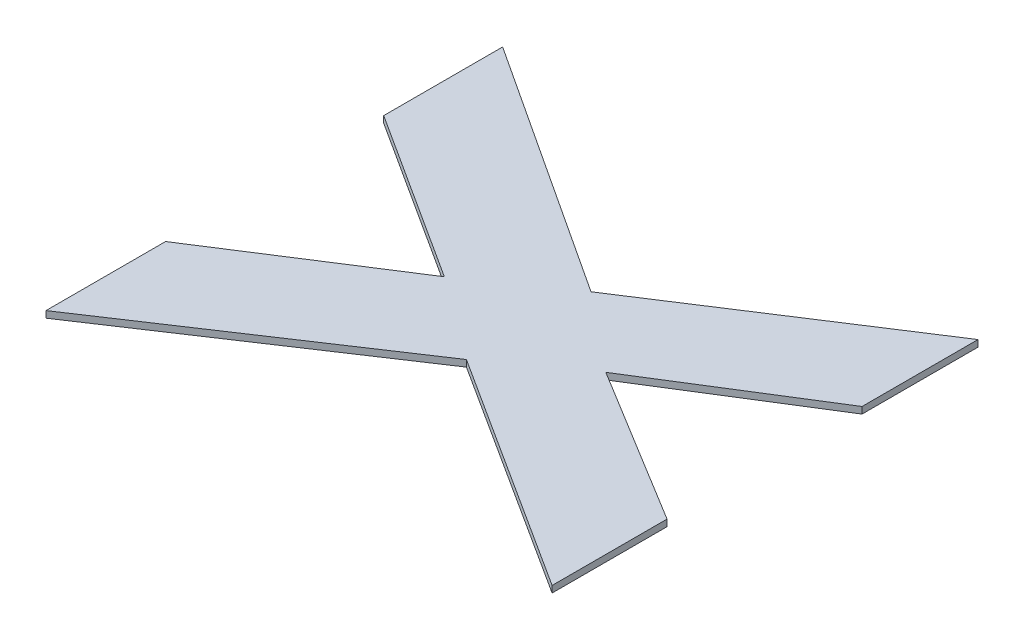
ISO-10303-21;
HEADER;
FILE_DESCRIPTION(('STEP AP214'),'2;1');
FILE_NAME('part.step','',(''),(''),'','','');
FILE_SCHEMA(('AUTOMOTIVE_DESIGN { 1 0 10303 214 1 1 1 1 }'));
ENDSEC;
DATA;
#1=APPLICATION_CONTEXT('core data for automotive mechanical design processes');
#2=APPLICATION_PROTOCOL_DEFINITION('international standard','automotive_design',2000,#1);
#3=PRODUCT_CONTEXT('',#1,'mechanical');
#4=PRODUCT('Part','Part','',(#3));
#5=PRODUCT_RELATED_PRODUCT_CATEGORY('part','',(#4));
#6=PRODUCT_DEFINITION_FORMATION('','',#4);
#7=PRODUCT_DEFINITION_CONTEXT('part definition',#1,'design');
#8=PRODUCT_DEFINITION('design','',#6,#7);
#9=PRODUCT_DEFINITION_SHAPE('','',#8);
#10=(LENGTH_UNIT() NAMED_UNIT(*) SI_UNIT(.MILLI.,.METRE.));
#11=(NAMED_UNIT(*) PLANE_ANGLE_UNIT() SI_UNIT($,.RADIAN.));
#12=(NAMED_UNIT(*) SI_UNIT($,.STERADIAN.) SOLID_ANGLE_UNIT());
#13=UNCERTAINTY_MEASURE_WITH_UNIT(LENGTH_MEASURE(1.E-05),#10,'distance_accuracy_value','');
#14=(GEOMETRIC_REPRESENTATION_CONTEXT(3) GLOBAL_UNCERTAINTY_ASSIGNED_CONTEXT((#13)) GLOBAL_UNIT_ASSIGNED_CONTEXT((#10,
#11,#12)) REPRESENTATION_CONTEXT('',''));
#15=CARTESIAN_POINT('',(0.,0.,0.));
#16=DIRECTION('',(0.,0.,1.));
#17=DIRECTION('',(1.,0.,0.));
#18=AXIS2_PLACEMENT_3D('',#15,#16,#17);
#19=CARTESIAN_POINT('',(-8.631267976045,2.15,0.));
#20=DIRECTION('',(0.,1.,0.));
#21=DIRECTION('',(0.,0.,1.));
#22=AXIS2_PLACEMENT_3D('',#19,#20,#21);
#23=PLANE('',#22);
#24=DIRECTION('',(-0.836537453966252,0.,-0.547909744494165));
#25=VECTOR('',#24,1.);
#26=CARTESIAN_POINT('',(-7.198317221772,2.15,-2.187800066864));
#27=LINE('',#26,#25);
#28=CARTESIAN_POINT('',(-0.470217038715667,2.15,2.21892629637267));
#29=VERTEX_POINT('',#28);
#30=CARTESIAN_POINT('',(-0.858135046261286,2.15,1.96485033672344));
#31=VERTEX_POINT('',#30);
#32=EDGE_CURVE('E175',#29,#31,#27,.T.);
#33=ORIENTED_EDGE('',*,*,#32,.F.);
#34=DIRECTION('',(-0.83929730748504,0.,0.543672722921026));
#35=VECTOR('',#34,1.);
#36=CARTESIAN_POINT('',(-5.206521455723,2.15,5.28696845022));
#37=LINE('',#36,#35);
#38=CARTESIAN_POINT('',(-0.114682950093471,2.15,1.98862151125227));
#39=VERTEX_POINT('',#38);
#40=EDGE_CURVE('E170',#39,#29,#37,.T.);
#41=ORIENTED_EDGE('',*,*,#40,.F.);
#42=DIRECTION('',(0.,0.,-1.));
#43=VECTOR('',#42,1.);
#44=CARTESIAN_POINT('',(-0.114682950093,2.15,0.));
#45=LINE('',#44,#43);
#46=CARTESIAN_POINT('',(-0.11468295009314,2.15,2.16414924202078));
#47=VERTEX_POINT('',#46);
#48=EDGE_CURVE('E164',#47,#39,#45,.T.);
#49=ORIENTED_EDGE('',*,*,#48,.F.);
#50=DIRECTION('',(0.848067047543028,0.,-0.529888934468018));
#51=VECTOR('',#50,1.);
#52=CARTESIAN_POINT('',(-5.267433494804,2.15,5.383688904157));
#53=LINE('',#52,#51);
#54=CARTESIAN_POINT('',(-0.353428224719446,2.15,2.31332197493964));
#55=VERTEX_POINT('',#54);
#56=EDGE_CURVE('E158',#55,#47,#53,.T.);
#57=ORIENTED_EDGE('',*,*,#56,.F.);
#58=DIRECTION('',(-0.853007877187864,0.,-0.521898037412917));
#59=VECTOR('',#58,1.);
#60=CARTESIAN_POINT('',(-7.406422104156,2.15,-2.001929691554));
#61=LINE('',#60,#59);
#62=CARTESIAN_POINT('',(-0.114682950092252,2.15,2.45939411987778));
#63=VERTEX_POINT('',#62);
#64=EDGE_CURVE('E152',#63,#55,#61,.T.);
#65=ORIENTED_EDGE('',*,*,#64,.F.);
#66=DIRECTION('',(0.,0.,-1.));
#67=VECTOR('',#66,1.);
#68=CARTESIAN_POINT('',(-0.114682950093,2.15,0.));
#69=LINE('',#68,#67);
#70=CARTESIAN_POINT('',(-0.114682950092664,2.15,2.63337155665548));
#71=VERTEX_POINT('',#70);
#72=EDGE_CURVE('E146',#71,#63,#69,.T.);
#73=ORIENTED_EDGE('',*,*,#72,.F.);
#74=DIRECTION('',(0.841986756871052,0.,0.539498193930033));
#75=VECTOR('',#74,1.);
#76=CARTESIAN_POINT('',(-7.348655116762,2.15,-2.001754693267));
#77=LINE('',#76,#75);
#78=CARTESIAN_POINT('',(-0.475729195126619,2.15,2.40203324220862));
#79=VERTEX_POINT('',#78);
#80=EDGE_CURVE('E140',#79,#71,#77,.T.);
#81=ORIENTED_EDGE('',*,*,#80,.F.);
#82=DIRECTION('',(0.83291509687509,0.,-0.55340079634706));
#83=VECTOR('',#82,1.);
#84=CARTESIAN_POINT('',(-5.026431012233,2.15,5.425585125196));
#85=LINE('',#84,#83);
#86=CARTESIAN_POINT('',(-0.85813504626084,2.15,2.65610920185824));
#87=VERTEX_POINT('',#86);
#88=EDGE_CURVE('E134',#87,#79,#85,.T.);
#89=ORIENTED_EDGE('',*,*,#88,.F.);
#90=DIRECTION('',(0.,0.,1.));
#91=VECTOR('',#90,1.);
#92=CARTESIAN_POINT('',(-0.858135046261,2.15,0.));
#93=LINE('',#92,#91);
#94=CARTESIAN_POINT('',(-0.858135046260842,2.15,2.47506931467725));
#95=VERTEX_POINT('',#94);
#96=EDGE_CURVE('E128',#95,#87,#93,.T.);
#97=ORIENTED_EDGE('',*,*,#96,.F.);
#98=DIRECTION('',(-0.841892276948779,0.,0.539645618914858));
#99=VECTOR('',#98,1.);
#100=CARTESIAN_POINT('',(-5.24311435946,2.15,5.285802873105));
#101=LINE('',#100,#99);
#102=CARTESIAN_POINT('',(-0.600958498629037,2.15,2.31022138695936));
#103=VERTEX_POINT('',#102);
#104=EDGE_CURVE('E104',#103,#95,#101,.T.);
#105=ORIENTED_EDGE('',*,*,#104,.F.);
#106=DIRECTION('',(0.841123556924868,0.,0.540843010480915));
#107=VECTOR('',#106,1.);
#108=CARTESIAN_POINT('',(-7.333269022533,2.15,-2.018658789161));
#109=LINE('',#108,#107);
#110=CARTESIAN_POINT('',(-0.8581350462611,2.15,2.14485669457715));
#111=VERTEX_POINT('',#110);
#112=EDGE_CURVE('E106',#111,#103,#109,.T.);
#113=ORIENTED_EDGE('',*,*,#112,.F.);
#114=DIRECTION('',(0.,0.,1.));
#115=VECTOR('',#114,1.);
#116=CARTESIAN_POINT('',(-0.858135046261,2.15,0.));
#117=LINE('',#116,#115);
#118=EDGE_CURVE('E20',#31,#111,#117,.T.);
#119=ORIENTED_EDGE('',*,*,#118,.F.);
#120=EDGE_LOOP('',(#33,#41,#49,#57,#65,#73,#81,#89,#97,#105,#113,#119));
#121=FACE_BOUND('',#120,.T.);
#122=ADVANCED_FACE('F17',(#121),#23,.F.);
#123=CARTESIAN_POINT('',(-0.858135046261,2.16,0.));
#124=DIRECTION('',(-1.,0.,0.));
#125=DIRECTION('',(0.,0.,1.));
#126=AXIS2_PLACEMENT_3D('',#123,#124,#125);
#127=PLANE('',#126);
#128=DIRECTION('',(0.,0.,1.));
#129=VECTOR('',#128,1.);
#130=CARTESIAN_POINT('',(-0.858135046261,2.16,0.));
#131=LINE('',#130,#129);
#132=CARTESIAN_POINT('',(-0.858135046261286,2.16,1.96485033672344));
#133=VERTEX_POINT('',#132);
#134=CARTESIAN_POINT('',(-0.8581350462611,2.16,2.14485669457715));
#135=VERTEX_POINT('',#134);
#136=EDGE_CURVE('E179',#133,#135,#131,.T.);
#137=ORIENTED_EDGE('',*,*,#136,.F.);
#138=DIRECTION('',(0.,1.,0.));
#139=VECTOR('',#138,1.);
#140=CARTESIAN_POINT('',(-0.858135046262146,2.16,1.96485033672475));
#141=LINE('',#140,#139);
#142=EDGE_CURVE('E117',#31,#133,#141,.T.);
#143=ORIENTED_EDGE('',*,*,#142,.F.);
#144=ORIENTED_EDGE('',*,*,#118,.T.);
#145=DIRECTION('',(0.,1.,0.));
#146=VECTOR('',#145,1.);
#147=CARTESIAN_POINT('',(-0.8581350462614,2.16,2.14485669457762));
#148=LINE('',#147,#146);
#149=EDGE_CURVE('E112',#135,#111,#148,.F.);
#150=ORIENTED_EDGE('',*,*,#149,.F.);
#151=EDGE_LOOP('',(#137,#143,#144,#150));
#152=FACE_BOUND('',#151,.T.);
#153=ADVANCED_FACE('F114',(#152),#127,.T.);
#154=CARTESIAN_POINT('',(-7.333269022533,2.16,-2.018658789161));
#155=DIRECTION('',(-0.540843010480915,0.,0.841123556924868));
#156=DIRECTION('',(0.841123556924868,0.,0.540843010480915));
#157=AXIS2_PLACEMENT_3D('',#154,#155,#156);
#158=PLANE('',#157);
#159=DIRECTION('',(0.841123556925301,0.,0.540843010480241));
#160=VECTOR('',#159,1.);
#161=CARTESIAN_POINT('',(-0.858135046261,2.16,2.144856694577));
#162=LINE('',#161,#160);
#163=CARTESIAN_POINT('',(-0.600958498629169,2.16,2.31022138695956));
#164=VERTEX_POINT('',#163);
#165=EDGE_CURVE('E121',#135,#164,#162,.T.);
#166=ORIENTED_EDGE('',*,*,#165,.F.);
#167=ORIENTED_EDGE('',*,*,#149,.T.);
#168=ORIENTED_EDGE('',*,*,#112,.T.);
#169=DIRECTION('',(0.,1.,0.));
#170=VECTOR('',#169,1.);
#171=CARTESIAN_POINT('',(-0.600958498628619,2.16,2.31022138695959));
#172=LINE('',#171,#170);
#173=EDGE_CURVE('E124',#164,#103,#172,.F.);
#174=ORIENTED_EDGE('',*,*,#173,.F.);
#175=EDGE_LOOP('',(#166,#167,#168,#174));
#176=FACE_BOUND('',#175,.T.);
#177=ADVANCED_FACE('F119',(#176),#158,.T.);
#178=CARTESIAN_POINT('',(-5.24311435946,2.16,5.285802873105));
#179=DIRECTION('',(-0.539645618914858,0.,-0.841892276948779));
#180=DIRECTION('',(-0.841892276948779,0.,0.539645618914858));
#181=AXIS2_PLACEMENT_3D('',#178,#179,#180);
#182=PLANE('',#181);
#183=DIRECTION('',(-0.841892276949596,0.,0.539645618913584));
#184=VECTOR('',#183,1.);
#185=CARTESIAN_POINT('',(-0.600958498629,2.16,2.310221386959));
#186=LINE('',#185,#184);
#187=CARTESIAN_POINT('',(-0.858135046260684,2.16,2.47506931467749));
#188=VERTEX_POINT('',#187);
#189=EDGE_CURVE('E182',#164,#188,#186,.T.);
#190=ORIENTED_EDGE('',*,*,#189,.F.);
#191=ORIENTED_EDGE('',*,*,#173,.T.);
#192=ORIENTED_EDGE('',*,*,#104,.T.);
#193=DIRECTION('',(0.,1.,0.));
#194=VECTOR('',#193,1.);
#195=CARTESIAN_POINT('',(-0.858135046261,2.16,2.475069314677));
#196=LINE('',#195,#194);
#197=EDGE_CURVE('E131',#188,#95,#196,.F.);
#198=ORIENTED_EDGE('',*,*,#197,.F.);
#199=EDGE_LOOP('',(#190,#191,#192,#198));
#200=FACE_BOUND('',#199,.T.);
#201=ADVANCED_FACE('F233',(#200),#182,.T.);
#202=CARTESIAN_POINT('',(-0.858135046261,2.16,0.));
#203=DIRECTION('',(-1.,0.,0.));
#204=DIRECTION('',(0.,0.,1.));
#205=AXIS2_PLACEMENT_3D('',#202,#203,#204);
#206=PLANE('',#205);
#207=DIRECTION('',(0.,0.,1.));
#208=VECTOR('',#207,1.);
#209=CARTESIAN_POINT('',(-0.858135046261,2.16,0.));
#210=LINE('',#209,#208);
#211=CARTESIAN_POINT('',(-0.85813504626084,2.16,2.65610920185824));
#212=VERTEX_POINT('',#211);
#213=EDGE_CURVE('E185',#188,#212,#210,.T.);
#214=ORIENTED_EDGE('',*,*,#213,.F.);
#215=ORIENTED_EDGE('',*,*,#197,.T.);
#216=ORIENTED_EDGE('',*,*,#96,.T.);
#217=DIRECTION('',(0.,1.,0.));
#218=VECTOR('',#217,1.);
#219=CARTESIAN_POINT('',(-0.85813504626036,2.16,2.65610920185896));
#220=LINE('',#219,#218);
#221=EDGE_CURVE('E137',#212,#87,#220,.F.);
#222=ORIENTED_EDGE('',*,*,#221,.F.);
#223=EDGE_LOOP('',(#214,#215,#216,#222));
#224=FACE_BOUND('',#223,.T.);
#225=ADVANCED_FACE('F230',(#224),#206,.T.);
#226=CARTESIAN_POINT('',(-5.026431012233,2.16,5.425585125196));
#227=DIRECTION('',(0.55340079634706,0.,0.83291509687509));
#228=DIRECTION('',(0.83291509687509,0.,-0.55340079634706));
#229=AXIS2_PLACEMENT_3D('',#226,#227,#228);
#230=PLANE('',#229);
#231=DIRECTION('',(0.832915096875875,0.,-0.553400796345877));
#232=VECTOR('',#231,1.);
#233=CARTESIAN_POINT('',(-0.858135046261,2.16,2.656109201858));
#234=LINE('',#233,#232);
#235=CARTESIAN_POINT('',(-0.475729195126548,2.16,2.40203324220872));
#236=VERTEX_POINT('',#235);
#237=EDGE_CURVE('E188',#212,#236,#234,.T.);
#238=ORIENTED_EDGE('',*,*,#237,.F.);
#239=ORIENTED_EDGE('',*,*,#221,.T.);
#240=ORIENTED_EDGE('',*,*,#88,.T.);
#241=DIRECTION('',(0.,1.,0.));
#242=VECTOR('',#241,1.);
#243=CARTESIAN_POINT('',(-0.475729195125754,2.16,2.40203324220706));
#244=LINE('',#243,#242);
#245=EDGE_CURVE('E143',#236,#79,#244,.F.);
#246=ORIENTED_EDGE('',*,*,#245,.F.);
#247=EDGE_LOOP('',(#238,#239,#240,#246));
#248=FACE_BOUND('',#247,.T.);
#249=ADVANCED_FACE('F227',(#248),#230,.T.);
#250=CARTESIAN_POINT('',(-7.348655116762,2.16,-2.001754693267));
#251=DIRECTION('',(-0.539498193930033,0.,0.841986756871052));
#252=DIRECTION('',(0.841986756871052,0.,0.539498193930033));
#253=AXIS2_PLACEMENT_3D('',#250,#251,#252);
#254=PLANE('',#253);
#255=DIRECTION('',(0.841986756870823,0.,0.53949819393039));
#256=VECTOR('',#255,1.);
#257=CARTESIAN_POINT('',(-0.475729195127001,2.16,2.402033242209));
#258=LINE('',#257,#256);
#259=CARTESIAN_POINT('',(-0.114682950092327,2.16,2.63337155665495));
#260=VERTEX_POINT('',#259);
#261=EDGE_CURVE('E191',#236,#260,#258,.T.);
#262=ORIENTED_EDGE('',*,*,#261,.F.);
#263=ORIENTED_EDGE('',*,*,#245,.T.);
#264=ORIENTED_EDGE('',*,*,#80,.T.);
#265=DIRECTION('',(0.,1.,0.));
#266=VECTOR('',#265,1.);
#267=CARTESIAN_POINT('',(-0.114682950093,2.16,2.633371556656));
#268=LINE('',#267,#266);
#269=EDGE_CURVE('E149',#260,#71,#268,.F.);
#270=ORIENTED_EDGE('',*,*,#269,.F.);
#271=EDGE_LOOP('',(#262,#263,#264,#270));
#272=FACE_BOUND('',#271,.T.);
#273=ADVANCED_FACE('F224',(#272),#254,.T.);
#274=CARTESIAN_POINT('',(-0.114682950093,2.16,0.));
#275=DIRECTION('',(1.,0.,0.));
#276=DIRECTION('',(0.,0.,-1.));
#277=AXIS2_PLACEMENT_3D('',#274,#275,#276);
#278=PLANE('',#277);
#279=DIRECTION('',(0.,0.,1.));
#280=VECTOR('',#279,1.);
#281=CARTESIAN_POINT('',(-0.114682950093,2.16,0.));
#282=LINE('',#281,#280);
#283=CARTESIAN_POINT('',(-0.114682950092252,2.16,2.45939411987778));
#284=VERTEX_POINT('',#283);
#285=EDGE_CURVE('E194',#260,#284,#282,.F.);
#286=ORIENTED_EDGE('',*,*,#285,.F.);
#287=ORIENTED_EDGE('',*,*,#269,.T.);
#288=ORIENTED_EDGE('',*,*,#72,.T.);
#289=DIRECTION('',(0.,1.,0.));
#290=VECTOR('',#289,1.);
#291=CARTESIAN_POINT('',(-0.114682950090008,2.16,2.45939411987411));
#292=LINE('',#291,#290);
#293=EDGE_CURVE('E155',#284,#63,#292,.F.);
#294=ORIENTED_EDGE('',*,*,#293,.F.);
#295=EDGE_LOOP('',(#286,#287,#288,#294));
#296=FACE_BOUND('',#295,.T.);
#297=ADVANCED_FACE('F221',(#296),#278,.T.);
#298=CARTESIAN_POINT('',(-7.406422104156,2.16,-2.001929691554));
#299=DIRECTION('',(0.521898037412917,0.,-0.853007877187864));
#300=DIRECTION('',(-0.853007877187864,0.,-0.521898037412917));
#301=AXIS2_PLACEMENT_3D('',#298,#299,#300);
#302=PLANE('',#301);
#303=DIRECTION('',(-0.853007877187114,0.,-0.521898037414142));
#304=VECTOR('',#303,1.);
#305=CARTESIAN_POINT('',(-0.114682950093,2.16,2.459394119879));
#306=LINE('',#305,#304);
#307=CARTESIAN_POINT('',(-0.35342822471875,2.16,2.3133219749385));
#308=VERTEX_POINT('',#307);
#309=EDGE_CURVE('E197',#284,#308,#306,.T.);
#310=ORIENTED_EDGE('',*,*,#309,.F.);
#311=ORIENTED_EDGE('',*,*,#293,.T.);
#312=ORIENTED_EDGE('',*,*,#64,.T.);
#313=DIRECTION('',(0.,1.,0.));
#314=VECTOR('',#313,1.);
#315=CARTESIAN_POINT('',(-0.353428224720565,2.16,2.3133219749401));
#316=LINE('',#315,#314);
#317=EDGE_CURVE('E161',#308,#55,#316,.F.);
#318=ORIENTED_EDGE('',*,*,#317,.F.);
#319=EDGE_LOOP('',(#310,#311,#312,#318));
#320=FACE_BOUND('',#319,.T.);
#321=ADVANCED_FACE('F218',(#320),#302,.T.);
#322=CARTESIAN_POINT('',(-5.267433494804,2.16,5.383688904157));
#323=DIRECTION('',(0.529888934468018,0.,0.848067047543028));
#324=DIRECTION('',(0.848067047543028,0.,-0.529888934468018));
#325=AXIS2_PLACEMENT_3D('',#322,#323,#324);
#326=PLANE('',#325);
#327=DIRECTION('',(0.848067047543002,0.,-0.52988893446806));
#328=VECTOR('',#327,1.);
#329=CARTESIAN_POINT('',(-0.353428224720001,2.16,2.313321974941));
#330=LINE('',#329,#328);
#331=CARTESIAN_POINT('',(-0.11468295009328,2.16,2.16414924202055));
#332=VERTEX_POINT('',#331);
#333=EDGE_CURVE('E200',#308,#332,#330,.T.);
#334=ORIENTED_EDGE('',*,*,#333,.F.);
#335=ORIENTED_EDGE('',*,*,#317,.T.);
#336=ORIENTED_EDGE('',*,*,#56,.T.);
#337=DIRECTION('',(0.,1.,0.));
#338=VECTOR('',#337,1.);
#339=CARTESIAN_POINT('',(-0.114682950093,2.16,2.164149242021));
#340=LINE('',#339,#338);
#341=EDGE_CURVE('E167',#332,#47,#340,.F.);
#342=ORIENTED_EDGE('',*,*,#341,.F.);
#343=EDGE_LOOP('',(#334,#335,#336,#342));
#344=FACE_BOUND('',#343,.T.);
#345=ADVANCED_FACE('F215',(#344),#326,.T.);
#346=CARTESIAN_POINT('',(-0.114682950093,2.16,0.));
#347=DIRECTION('',(1.,0.,0.));
#348=DIRECTION('',(0.,0.,-1.));
#349=AXIS2_PLACEMENT_3D('',#346,#347,#348);
#350=PLANE('',#349);
#351=DIRECTION('',(0.,0.,1.));
#352=VECTOR('',#351,1.);
#353=CARTESIAN_POINT('',(-0.114682950093,2.16,0.));
#354=LINE('',#353,#352);
#355=CARTESIAN_POINT('',(-0.114682950093471,2.16,1.98862151125227));
#356=VERTEX_POINT('',#355);
#357=EDGE_CURVE('E203',#332,#356,#354,.F.);
#358=ORIENTED_EDGE('',*,*,#357,.F.);
#359=ORIENTED_EDGE('',*,*,#341,.T.);
#360=ORIENTED_EDGE('',*,*,#48,.T.);
#361=DIRECTION('',(0.,1.,0.));
#362=VECTOR('',#361,1.);
#363=CARTESIAN_POINT('',(-0.114682950094883,2.16,1.98862151125009));
#364=LINE('',#363,#362);
#365=EDGE_CURVE('E172',#356,#39,#364,.F.);
#366=ORIENTED_EDGE('',*,*,#365,.F.);
#367=EDGE_LOOP('',(#358,#359,#360,#366));
#368=FACE_BOUND('',#367,.T.);
#369=ADVANCED_FACE('F212',(#368),#350,.T.);
#370=CARTESIAN_POINT('',(-5.206521455723,2.16,5.28696845022));
#371=DIRECTION('',(-0.543672722921026,0.,-0.83929730748504));
#372=DIRECTION('',(-0.83929730748504,0.,0.543672722921026));
#373=AXIS2_PLACEMENT_3D('',#370,#371,#372);
#374=PLANE('',#373);
#375=DIRECTION('',(-0.839297307485336,0.,0.543672722920568));
#376=VECTOR('',#375,1.);
#377=CARTESIAN_POINT('',(-0.114682950093,2.16,1.988621511253));
#378=LINE('',#377,#376);
#379=CARTESIAN_POINT('',(-0.470217038716106,2.16,2.21892629637199));
#380=VERTEX_POINT('',#379);
#381=EDGE_CURVE('E26',#356,#380,#378,.T.);
#382=ORIENTED_EDGE('',*,*,#381,.F.);
#383=ORIENTED_EDGE('',*,*,#365,.T.);
#384=ORIENTED_EDGE('',*,*,#40,.T.);
#385=DIRECTION('',(0.,1.,0.));
#386=VECTOR('',#385,1.);
#387=CARTESIAN_POINT('',(-0.470217038715911,2.16,2.21892629637439));
#388=LINE('',#387,#386);
#389=EDGE_CURVE('E35',#380,#29,#388,.F.);
#390=ORIENTED_EDGE('',*,*,#389,.F.);
#391=EDGE_LOOP('',(#382,#383,#384,#390));
#392=FACE_BOUND('',#391,.T.);
#393=ADVANCED_FACE('F210',(#392),#374,.T.);
#394=CARTESIAN_POINT('',(-7.198317221772,2.16,-2.187800066864));
#395=DIRECTION('',(0.547909744494165,0.,-0.836537453966252));
#396=DIRECTION('',(-0.836537453966252,0.,-0.547909744494165));
#397=AXIS2_PLACEMENT_3D('',#394,#395,#396);
#398=PLANE('',#397);
#399=DIRECTION('',(-0.836537453965745,0.,-0.547909744494939));
#400=VECTOR('',#399,1.);
#401=CARTESIAN_POINT('',(-0.470217038715,2.16,2.218926296373));
#402=LINE('',#401,#400);
#403=EDGE_CURVE('E11',#380,#133,#402,.T.);
#404=ORIENTED_EDGE('',*,*,#403,.F.);
#405=ORIENTED_EDGE('',*,*,#389,.T.);
#406=ORIENTED_EDGE('',*,*,#32,.T.);
#407=ORIENTED_EDGE('',*,*,#142,.T.);
#408=EDGE_LOOP('',(#404,#405,#406,#407));
#409=FACE_BOUND('',#408,.T.);
#410=ADVANCED_FACE('F235',(#409),#398,.T.);
#411=CARTESIAN_POINT('',(-8.631267976045,2.16,0.));
#412=DIRECTION('',(0.,1.,0.));
#413=DIRECTION('',(0.,0.,1.));
#414=AXIS2_PLACEMENT_3D('',#411,#412,#413);
#415=PLANE('',#414);
#416=ORIENTED_EDGE('',*,*,#381,.T.);
#417=ORIENTED_EDGE('',*,*,#403,.T.);
#418=ORIENTED_EDGE('',*,*,#136,.T.);
#419=ORIENTED_EDGE('',*,*,#165,.T.);
#420=ORIENTED_EDGE('',*,*,#189,.T.);
#421=ORIENTED_EDGE('',*,*,#213,.T.);
#422=ORIENTED_EDGE('',*,*,#237,.T.);
#423=ORIENTED_EDGE('',*,*,#261,.T.);
#424=ORIENTED_EDGE('',*,*,#285,.T.);
#425=ORIENTED_EDGE('',*,*,#309,.T.);
#426=ORIENTED_EDGE('',*,*,#333,.T.);
#427=ORIENTED_EDGE('',*,*,#357,.T.);
#428=EDGE_LOOP('',(#416,#417,#418,#419,#420,#421,#422,#423,#424,#425,#426,#427));
#429=FACE_BOUND('',#428,.T.);
#430=ADVANCED_FACE('F208',(#429),#415,.T.);
#431=CLOSED_SHELL('',(#122,#153,#177,#201,#225,#249,#273,#297,#321,#345,#369,#393,#410,#430));
#432=MANIFOLD_SOLID_BREP('B1',#431);
#433=ADVANCED_BREP_SHAPE_REPRESENTATION('',(#18,#432),#14);
#434=SHAPE_DEFINITION_REPRESENTATION(#9,#433);
ENDSEC;
END-ISO-10303-21;
